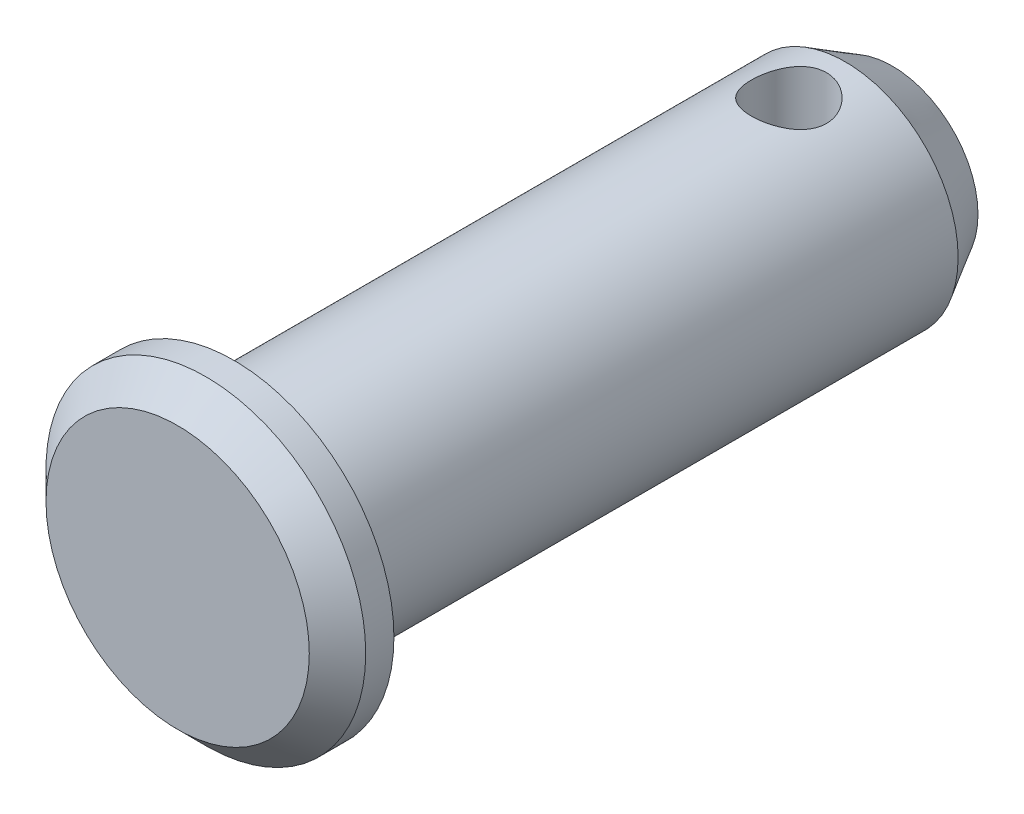
ISO-10303-21;
HEADER;
FILE_DESCRIPTION(('STEP AP214'),'2;1');
FILE_NAME('part.step','',(''),(''),'','','');
FILE_SCHEMA(('AUTOMOTIVE_DESIGN { 1 0 10303 214 1 1 1 1 }'));
ENDSEC;
DATA;
#1=APPLICATION_CONTEXT('core data for automotive mechanical design processes');
#2=APPLICATION_PROTOCOL_DEFINITION('international standard','automotive_design',2000,#1);
#3=PRODUCT_CONTEXT('',#1,'mechanical');
#4=PRODUCT('Part','Part','',(#3));
#5=PRODUCT_RELATED_PRODUCT_CATEGORY('part','',(#4));
#6=PRODUCT_DEFINITION_FORMATION('','',#4);
#7=PRODUCT_DEFINITION_CONTEXT('part definition',#1,'design');
#8=PRODUCT_DEFINITION('design','',#6,#7);
#9=PRODUCT_DEFINITION_SHAPE('','',#8);
#10=(LENGTH_UNIT() NAMED_UNIT(*) SI_UNIT(.MILLI.,.METRE.));
#11=(NAMED_UNIT(*) PLANE_ANGLE_UNIT() SI_UNIT($,.RADIAN.));
#12=(NAMED_UNIT(*) SI_UNIT($,.STERADIAN.) SOLID_ANGLE_UNIT());
#13=UNCERTAINTY_MEASURE_WITH_UNIT(LENGTH_MEASURE(1.E-05),#10,'distance_accuracy_value','');
#14=(GEOMETRIC_REPRESENTATION_CONTEXT(3) GLOBAL_UNCERTAINTY_ASSIGNED_CONTEXT((#13)) GLOBAL_UNIT_ASSIGNED_CONTEXT((#10,
#11,#12)) REPRESENTATION_CONTEXT('',''));
#15=CARTESIAN_POINT('',(0.,0.,0.));
#16=DIRECTION('',(0.,0.,1.));
#17=DIRECTION('',(1.,0.,0.));
#18=AXIS2_PLACEMENT_3D('',#15,#16,#17);
#19=CARTESIAN_POINT('',(0.,0.,19.));
#20=DIRECTION('',(0.,0.,-1.));
#21=DIRECTION('',(-1.,0.,0.));
#22=AXIS2_PLACEMENT_3D('',#19,#20,#21);
#23=PLANE('',#22);
#24=CARTESIAN_POINT('',(0.,0.,19.));
#25=DIRECTION('',(0.,0.,1.));
#26=DIRECTION('',(1.,0.,0.));
#27=AXIS2_PLACEMENT_3D('',#24,#25,#26);
#28=CIRCLE('',#27,7.);
#29=CARTESIAN_POINT('',(7.,0.,19.));
#30=VERTEX_POINT('',#29);
#31=EDGE_CURVE('E10',#30,#30,#28,.T.);
#32=ORIENTED_EDGE('',*,*,#31,.T.);
#33=EDGE_LOOP('',(#32));
#34=FACE_BOUND('',#33,.T.);
#35=ADVANCED_FACE('F33',(#34),#23,.F.);
#36=CARTESIAN_POINT('',(0.,0.,17.5));
#37=DIRECTION('',(0.,0.,-1.));
#38=DIRECTION('',(-1.,0.,0.));
#39=AXIS2_PLACEMENT_3D('',#36,#37,#38);
#40=CONICAL_SURFACE('',#39,8.5,0.785398163397445);
#41=ORIENTED_EDGE('',*,*,#31,.F.);
#42=EDGE_LOOP('',(#41));
#43=FACE_BOUND('',#42,.T.);
#44=CARTESIAN_POINT('',(0.,0.,17.5));
#45=DIRECTION('',(0.,0.,1.));
#46=DIRECTION('',(1.,0.,0.));
#47=AXIS2_PLACEMENT_3D('',#44,#45,#46);
#48=CIRCLE('',#47,8.5);
#49=CARTESIAN_POINT('',(8.5,0.,17.5));
#50=VERTEX_POINT('',#49);
#51=EDGE_CURVE('E45',#50,#50,#48,.T.);
#52=ORIENTED_EDGE('',*,*,#51,.T.);
#53=EDGE_LOOP('',(#52));
#54=FACE_BOUND('',#53,.T.);
#55=ADVANCED_FACE('F82',(#43,#54),#40,.T.);
#56=CARTESIAN_POINT('',(0.,0.,19.));
#57=DIRECTION('',(0.,0.,1.));
#58=DIRECTION('',(1.,0.,0.));
#59=AXIS2_PLACEMENT_3D('',#56,#57,#58);
#60=CYLINDRICAL_SURFACE('',#59,8.5);
#61=ORIENTED_EDGE('',*,*,#51,.F.);
#62=EDGE_LOOP('',(#61));
#63=FACE_BOUND('',#62,.T.);
#64=CARTESIAN_POINT('',(0.,0.,16.));
#65=DIRECTION('',(0.,0.,1.));
#66=DIRECTION('',(1.,0.,0.));
#67=AXIS2_PLACEMENT_3D('',#64,#65,#66);
#68=CIRCLE('',#67,8.5);
#69=CARTESIAN_POINT('',(8.5,0.,16.));
#70=VERTEX_POINT('',#69);
#71=EDGE_CURVE('E50',#70,#70,#68,.T.);
#72=ORIENTED_EDGE('',*,*,#71,.T.);
#73=EDGE_LOOP('',(#72));
#74=FACE_BOUND('',#73,.T.);
#75=ADVANCED_FACE('F86',(#63,#74),#60,.T.);
#76=CARTESIAN_POINT('',(0.,0.,16.));
#77=DIRECTION('',(0.,0.,1.));
#78=DIRECTION('',(1.,0.,0.));
#79=AXIS2_PLACEMENT_3D('',#76,#77,#78);
#80=PLANE('',#79);
#81=ORIENTED_EDGE('',*,*,#71,.F.);
#82=EDGE_LOOP('',(#81));
#83=FACE_BOUND('',#82,.T.);
#84=CARTESIAN_POINT('',(0.,0.,16.));
#85=DIRECTION('',(0.,0.,1.));
#86=DIRECTION('',(1.,0.,0.));
#87=AXIS2_PLACEMENT_3D('',#84,#85,#86);
#88=CIRCLE('',#87,6.);
#89=CARTESIAN_POINT('',(6.,0.,16.));
#90=VERTEX_POINT('',#89);
#91=EDGE_CURVE('E103',#90,#90,#88,.T.);
#92=ORIENTED_EDGE('',*,*,#91,.T.);
#93=EDGE_LOOP('',(#92));
#94=FACE_BOUND('',#93,.T.);
#95=ADVANCED_FACE('F77',(#83,#94),#80,.F.);
#96=CARTESIAN_POINT('',(0.,0.,19.));
#97=DIRECTION('',(0.,0.,1.));
#98=DIRECTION('',(1.,0.,0.));
#99=AXIS2_PLACEMENT_3D('',#96,#97,#98);
#100=CYLINDRICAL_SURFACE('',#99,6.);
#101=CARTESIAN_POINT('',(0.,-6.,-11.5));
#102=CARTESIAN_POINT('',(0.109126725773446,-6.00000030601888,-11.4999994925367));
#103=CARTESIAN_POINT('',(0.2182503890771,-5.9969953901509,-11.5089605322544));
#104=CARTESIAN_POINT('',(0.433283521745944,-5.98530420406562,-11.5444582176344));
#105=CARTESIAN_POINT('',(0.539192656237635,-5.97661734404305,-11.5709966878978));
#106=CARTESIAN_POINT('',(0.744665579003552,-5.95450615812885,-11.6406384867681));
#107=CARTESIAN_POINT('',(0.844239651772069,-5.94108975461707,-11.6837141249185));
#108=CARTESIAN_POINT('',(1.03474987361065,-5.91088891434684,-11.7850823456767));
#109=CARTESIAN_POINT('',(1.12568431391741,-5.89410381335556,-11.8433779300052));
#110=CARTESIAN_POINT('',(1.29948335004453,-5.8582818888601,-11.9756516097175));
#111=CARTESIAN_POINT('',(1.38200740059662,-5.8391911292757,-12.050062468521));
#112=CARTESIAN_POINT('',(1.53366538540417,-5.80120629566243,-12.2115343094131));
#113=CARTESIAN_POINT('',(1.60279637097892,-5.78231226581098,-12.298598069857));
#114=CARTESIAN_POINT('',(1.72764988445572,-5.74626664954548,-12.4859702303929));
#115=CARTESIAN_POINT('',(1.78292971644206,-5.72918078551376,-12.5865874794642));
#116=CARTESIAN_POINT('',(1.87563774775544,-5.69950610837202,-12.7963521889171));
#117=CARTESIAN_POINT('',(1.91307139477353,-5.68691592321491,-12.9054970343255));
#118=CARTESIAN_POINT('',(1.96774692301833,-5.66822606538755,-13.1253464429934));
#119=CARTESIAN_POINT('',(1.98562689654354,-5.66192191539223,-13.2358744169781));
#120=CARTESIAN_POINT('',(2.00268224666895,-5.65591313259015,-13.4585275083118));
#121=CARTESIAN_POINT('',(2.00186340320944,-5.6562064604546,-13.5706521214184));
#122=CARTESIAN_POINT('',(1.98203980740684,-5.6631803001636,-13.787873260888));
#123=CARTESIAN_POINT('',(1.96386782633399,-5.66956831735066,-13.893056805838));
#124=CARTESIAN_POINT('',(1.91121232569883,-5.68753315449102,-14.0987868392137));
#125=CARTESIAN_POINT('',(1.87672685318374,-5.69911059568215,-14.1993327708701));
#126=CARTESIAN_POINT('',(1.79187811612042,-5.72635822262498,-14.394825499183));
#127=CARTESIAN_POINT('',(1.74126809741453,-5.74209131586235,-14.489656050939));
#128=CARTESIAN_POINT('',(1.62577821260628,-5.77585117151453,-14.6697418165594));
#129=CARTESIAN_POINT('',(1.56089422472801,-5.79387859580927,-14.7549942538668));
#130=CARTESIAN_POINT('',(1.41469866536448,-5.83134658335482,-14.9181831963215));
#131=CARTESIAN_POINT('',(1.33270630015262,-5.85081178709686,-14.9955053890181));
#132=CARTESIAN_POINT('',(1.15667913994013,-5.88813876774073,-15.1354625333268));
#133=CARTESIAN_POINT('',(1.06264319132163,-5.90600039076135,-15.198096076329));
#134=CARTESIAN_POINT('',(0.863895226092536,-5.93834215875587,-15.3073926004701));
#135=CARTESIAN_POINT('',(0.759086552832673,-5.95278700016079,-15.3538909826815));
#136=CARTESIAN_POINT('',(0.542538166729016,-5.9764113428887,-15.4284063479114));
#137=CARTESIAN_POINT('',(0.430800876309908,-5.98559267309759,-15.4564297508469));
#138=CARTESIAN_POINT('',(0.208767659058608,-5.99735254142881,-15.4921113320447));
#139=CARTESIAN_POINT('',(0.0986191997296927,-6.00020003667456,-15.5005996183455));
#140=CARTESIAN_POINT('',(-0.121550139920475,-5.99977805389655,-15.4993346528031));
#141=CARTESIAN_POINT('',(-0.231571038639301,-5.99650960838725,-15.4895844800402));
#142=CARTESIAN_POINT('',(-0.445039732608511,-5.98440049434209,-15.4527761845281));
#143=CARTESIAN_POINT('',(-0.548585613669687,-5.97572397422385,-15.426227587901));
#144=CARTESIAN_POINT('',(-0.749711917159147,-5.9538369366014,-15.3572131110665));
#145=CARTESIAN_POINT('',(-0.847291577017213,-5.9406258409335,-15.3147452010644));
#146=CARTESIAN_POINT('',(-1.03657659278655,-5.9105786257458,-15.2138591363184));
#147=CARTESIAN_POINT('',(-1.12805991843429,-5.89365629511572,-15.1550508134337));
#148=CARTESIAN_POINT('',(-1.30012966027117,-5.85810507832525,-15.023611699973));
#149=CARTESIAN_POINT('',(-1.38071273559115,-5.83947567187655,-14.9509766879365));
#150=CARTESIAN_POINT('',(-1.5325050156126,-5.8015369596089,-14.7900424979868));
#151=CARTESIAN_POINT('',(-1.60312193849154,-5.78223522174856,-14.7011815461463));
#152=CARTESIAN_POINT('',(-1.72851504464715,-5.74599946589418,-14.5124568643782));
#153=CARTESIAN_POINT('',(-1.78329109586203,-5.72906546764005,-14.4125930427318));
#154=CARTESIAN_POINT('',(-1.87519386083272,-5.69964783582767,-14.2046539694202));
#155=CARTESIAN_POINT('',(-1.91235626433004,-5.68715521585958,-14.0965958416625));
#156=CARTESIAN_POINT('',(-1.96778933351871,-5.66821664612899,-13.8752426999117));
#157=CARTESIAN_POINT('',(-1.98606850990788,-5.66176797247279,-13.7619500691913));
#158=CARTESIAN_POINT('',(-2.00255256495468,-5.65595717748355,-13.5396058079182));
#159=CARTESIAN_POINT('',(-2.0017405146168,-5.65624800514831,-13.4306353194264));
#160=CARTESIAN_POINT('',(-1.98248458689739,-5.66302539647735,-13.2144698501559));
#161=CARTESIAN_POINT('',(-1.96404175891717,-5.66951159138724,-13.1072747640898));
#162=CARTESIAN_POINT('',(-1.91074362625869,-5.68769048609784,-12.8997286739951));
#163=CARTESIAN_POINT('',(-1.87620669203103,-5.69928196044955,-12.799286349991));
#164=CARTESIAN_POINT('',(-1.79195873151949,-5.72632797636937,-12.6055451861235));
#165=CARTESIAN_POINT('',(-1.74224433710761,-5.74178337526787,-12.512247937624));
#166=CARTESIAN_POINT('',(-1.62652138516686,-5.77565658452093,-12.3310326601542));
#167=CARTESIAN_POINT('',(-1.55989648552916,-5.79417423284274,-12.2435269962032));
#168=CARTESIAN_POINT('',(-1.4132857662713,-5.83166712566506,-12.0806203732316));
#169=CARTESIAN_POINT('',(-1.33329616890296,-5.85064249824745,-12.0052228486239));
#170=CARTESIAN_POINT('',(-1.15848311384138,-5.88780061051088,-11.8657111754216));
#171=CARTESIAN_POINT('',(-1.06320302699946,-5.90592363602514,-11.802151304498));
#172=CARTESIAN_POINT('',(-0.862714714813249,-5.93851982345224,-11.6920191422987));
#173=CARTESIAN_POINT('',(-0.757509036264697,-5.9529939181586,-11.6454425081559));
#174=CARTESIAN_POINT('',(-0.544987294401951,-5.97611030137084,-11.5725567350227));
#175=CARTESIAN_POINT('',(-0.437975515352817,-5.98498424845045,-11.5454350674732));
#176=CARTESIAN_POINT('',(-0.220640832020494,-5.99692814128444,-11.5091594386457));
#177=CARTESIAN_POINT('',(-0.110318851137493,-5.9999996906381,-11.5000005130069));
#178=CARTESIAN_POINT('',(0.,-6.,-11.5));
#179=B_SPLINE_CURVE_WITH_KNOTS('',3,(#101,#102,#103,#104,#105,#106,#107,#108,#109,#110,#111,
#112,#113,#114,#115,#116,#117,#118,#119,#120,#121,#122,#123,#124,#125,#126,#127,#128,#129,#130,
#131,#132,#133,#134,#135,#136,#137,#138,#139,#140,#141,#142,#143,#144,#145,#146,#147,#148,#149,
#150,#151,#152,#153,#154,#155,#156,#157,#158,#159,#160,#161,#162,#163,#164,#165,#166,#167,#168,
#169,#170,#171,#172,#173,#174,#175,#176,#177,#178),.UNSPECIFIED.,.T.,.F.,(4,2,2,2,2,2,2,2,2,2,2,
2,2,2,2,2,2,2,2,2,2,2,2,2,2,2,2,2,2,2,2,2,2,2,2,2,2,2,4),(0.,0.326974212052022,
0.653982370535041,0.980445345740549,1.3069727555982,1.64369368565512,1.9804886657506,
2.32696769646941,2.67334089385667,3.0080385148368,3.34263267974971,3.6619365310256,
3.98127861710964,4.30576342310261,4.63034205116414,4.97186611622734,5.31342291933237,
5.65836811300715,6.00319337754417,6.33307166350339,6.66289426328353,6.98316315956427,
7.30347290568208,7.63220799687473,7.96104361643782,8.30482045761504,8.64860016469993,
8.9916802765354,9.3346056941168,9.65991332128517,9.9852015870275,10.3043117416084,
10.6234927635196,10.9566013338361,11.2898042224756,11.635993216702,11.9820936230491,
12.3127311674763,12.6432773207628),.UNSPECIFIED.);
#180=CARTESIAN_POINT('',(0.,-6.,-11.5));
#181=VERTEX_POINT('',#180);
#182=EDGE_CURVE('E36',#181,#181,#179,.T.);
#183=ORIENTED_EDGE('',*,*,#182,.T.);
#184=EDGE_LOOP('',(#183));
#185=FACE_BOUND('',#184,.T.);
#186=CARTESIAN_POINT('',(0.,6.,-11.5));
#187=CARTESIAN_POINT('',(-0.109126725773446,6.00000030601888,-11.4999994925367));
#188=CARTESIAN_POINT('',(-0.2182503890771,5.9969953901509,-11.5089605322544));
#189=CARTESIAN_POINT('',(-0.433283521745944,5.98530420406562,-11.5444582176344));
#190=CARTESIAN_POINT('',(-0.539192656237635,5.97661734404305,-11.5709966878978));
#191=CARTESIAN_POINT('',(-0.744665579003552,5.95450615812885,-11.6406384867681));
#192=CARTESIAN_POINT('',(-0.844239651772068,5.94108975461707,-11.6837141249185));
#193=CARTESIAN_POINT('',(-1.03474987361065,5.91088891434684,-11.7850823456767));
#194=CARTESIAN_POINT('',(-1.12568431391741,5.89410381335556,-11.8433779300052));
#195=CARTESIAN_POINT('',(-1.29948335004453,5.8582818888601,-11.9756516097175));
#196=CARTESIAN_POINT('',(-1.38200740059662,5.8391911292757,-12.050062468521));
#197=CARTESIAN_POINT('',(-1.53366538540417,5.80120629566243,-12.2115343094131));
#198=CARTESIAN_POINT('',(-1.60279637097892,5.78231226581098,-12.298598069857));
#199=CARTESIAN_POINT('',(-1.72764988445572,5.74626664954548,-12.4859702303929));
#200=CARTESIAN_POINT('',(-1.78292971644206,5.72918078551377,-12.5865874794642));
#201=CARTESIAN_POINT('',(-1.87563774775544,5.69950610837203,-12.7963521889171));
#202=CARTESIAN_POINT('',(-1.91307139477353,5.68691592321492,-12.9054970343255));
#203=CARTESIAN_POINT('',(-1.96774692301833,5.66822606538755,-13.1253464429934));
#204=CARTESIAN_POINT('',(-1.98562689654354,5.66192191539223,-13.2358744169781));
#205=CARTESIAN_POINT('',(-2.00268224666895,5.65591313259015,-13.4585275083118));
#206=CARTESIAN_POINT('',(-2.00186340320944,5.6562064604546,-13.5706521214184));
#207=CARTESIAN_POINT('',(-1.98203980740684,5.66318030016361,-13.787873260888));
#208=CARTESIAN_POINT('',(-1.96386782633399,5.66956831735066,-13.893056805838));
#209=CARTESIAN_POINT('',(-1.91121232569883,5.68753315449102,-14.0987868392137));
#210=CARTESIAN_POINT('',(-1.87672685318374,5.69911059568215,-14.1993327708701));
#211=CARTESIAN_POINT('',(-1.79187811612042,5.72635822262498,-14.394825499183));
#212=CARTESIAN_POINT('',(-1.74126809741453,5.74209131586235,-14.489656050939));
#213=CARTESIAN_POINT('',(-1.62577821260628,5.77585117151453,-14.6697418165594));
#214=CARTESIAN_POINT('',(-1.56089422472801,5.79387859580927,-14.7549942538668));
#215=CARTESIAN_POINT('',(-1.41469866536448,5.83134658335482,-14.9181831963215));
#216=CARTESIAN_POINT('',(-1.33270630015262,5.85081178709686,-14.9955053890181));
#217=CARTESIAN_POINT('',(-1.15667913994013,5.88813876774074,-15.1354625333268));
#218=CARTESIAN_POINT('',(-1.06264319132163,5.90600039076135,-15.198096076329));
#219=CARTESIAN_POINT('',(-0.863895226092536,5.93834215875587,-15.3073926004701));
#220=CARTESIAN_POINT('',(-0.759086552832674,5.95278700016079,-15.3538909826815));
#221=CARTESIAN_POINT('',(-0.542538166729016,5.9764113428887,-15.4284063479114));
#222=CARTESIAN_POINT('',(-0.430800876309908,5.98559267309759,-15.4564297508469));
#223=CARTESIAN_POINT('',(-0.208767659058609,5.99735254142881,-15.4921113320447));
#224=CARTESIAN_POINT('',(-0.0986191997296927,6.00020003667456,-15.5005996183455));
#225=CARTESIAN_POINT('',(0.121550139920475,5.99977805389655,-15.4993346528031));
#226=CARTESIAN_POINT('',(0.231571038639301,5.99650960838725,-15.4895844800402));
#227=CARTESIAN_POINT('',(0.445039732608511,5.98440049434209,-15.4527761845281));
#228=CARTESIAN_POINT('',(0.548585613669686,5.97572397422385,-15.426227587901));
#229=CARTESIAN_POINT('',(0.749711917159147,5.9538369366014,-15.3572131110665));
#230=CARTESIAN_POINT('',(0.847291577017212,5.9406258409335,-15.3147452010644));
#231=CARTESIAN_POINT('',(1.03657659278655,5.9105786257458,-15.2138591363184));
#232=CARTESIAN_POINT('',(1.12805991843429,5.89365629511572,-15.1550508134337));
#233=CARTESIAN_POINT('',(1.30012966027117,5.85810507832525,-15.023611699973));
#234=CARTESIAN_POINT('',(1.38071273559115,5.83947567187655,-14.9509766879365));
#235=CARTESIAN_POINT('',(1.5325050156126,5.8015369596089,-14.7900424979868));
#236=CARTESIAN_POINT('',(1.60312193849154,5.78223522174856,-14.7011815461463));
#237=CARTESIAN_POINT('',(1.72851504464715,5.74599946589418,-14.5124568643782));
#238=CARTESIAN_POINT('',(1.78329109586203,5.72906546764005,-14.4125930427318));
#239=CARTESIAN_POINT('',(1.87519386083272,5.69964783582767,-14.2046539694202));
#240=CARTESIAN_POINT('',(1.91235626433004,5.68715521585958,-14.0965958416625));
#241=CARTESIAN_POINT('',(1.96778933351871,5.66821664612899,-13.8752426999117));
#242=CARTESIAN_POINT('',(1.98606850990788,5.66176797247279,-13.7619500691913));
#243=CARTESIAN_POINT('',(2.00255256495468,5.65595717748354,-13.5396058079182));
#244=CARTESIAN_POINT('',(2.0017405146168,5.6562480051483,-13.4306353194263));
#245=CARTESIAN_POINT('',(1.98248458689739,5.66302539647735,-13.2144698501559));
#246=CARTESIAN_POINT('',(1.96404175891717,5.66951159138723,-13.1072747640898));
#247=CARTESIAN_POINT('',(1.91074362625869,5.68769048609783,-12.8997286739951));
#248=CARTESIAN_POINT('',(1.87620669203103,5.69928196044955,-12.799286349991));
#249=CARTESIAN_POINT('',(1.79195873151949,5.72632797636937,-12.6055451861235));
#250=CARTESIAN_POINT('',(1.74224433710761,5.74178337526786,-12.512247937624));
#251=CARTESIAN_POINT('',(1.62652138516686,5.77565658452093,-12.3310326601542));
#252=CARTESIAN_POINT('',(1.55989648552916,5.79417423284274,-12.2435269962032));
#253=CARTESIAN_POINT('',(1.4132857662713,5.83166712566506,-12.0806203732316));
#254=CARTESIAN_POINT('',(1.33329616890296,5.85064249824745,-12.0052228486239));
#255=CARTESIAN_POINT('',(1.15848311384138,5.88780061051088,-11.8657111754216));
#256=CARTESIAN_POINT('',(1.06320302699946,5.90592363602513,-11.802151304498));
#257=CARTESIAN_POINT('',(0.862714714813249,5.93851982345224,-11.6920191422987));
#258=CARTESIAN_POINT('',(0.757509036264697,5.9529939181586,-11.6454425081559));
#259=CARTESIAN_POINT('',(0.544987294401952,5.97611030137084,-11.5725567350227));
#260=CARTESIAN_POINT('',(0.437975515352818,5.98498424845045,-11.5454350674732));
#261=CARTESIAN_POINT('',(0.220640832020495,5.99692814128444,-11.5091594386457));
#262=CARTESIAN_POINT('',(0.110318851137493,5.9999996906381,-11.5000005130069));
#263=CARTESIAN_POINT('',(0.,6.,-11.5));
#264=B_SPLINE_CURVE_WITH_KNOTS('',3,(#186,#187,#188,#189,#190,#191,#192,#193,#194,#195,#196,
#197,#198,#199,#200,#201,#202,#203,#204,#205,#206,#207,#208,#209,#210,#211,#212,#213,#214,#215,
#216,#217,#218,#219,#220,#221,#222,#223,#224,#225,#226,#227,#228,#229,#230,#231,#232,#233,#234,
#235,#236,#237,#238,#239,#240,#241,#242,#243,#244,#245,#246,#247,#248,#249,#250,#251,#252,#253,
#254,#255,#256,#257,#258,#259,#260,#261,#262,#263),.UNSPECIFIED.,.T.,.F.,(4,2,2,2,2,2,2,2,2,2,2,
2,2,2,2,2,2,2,2,2,2,2,2,2,2,2,2,2,2,2,2,2,2,2,2,2,2,2,4),(0.,0.326974212052022,
0.653982370535041,0.980445345740547,1.3069727555982,1.64369368565512,1.9804886657506,
2.32696769646941,2.67334089385667,3.0080385148368,3.34263267974971,3.6619365310256,
3.98127861710964,4.30576342310261,4.63034205116414,4.97186611622734,5.31342291933237,
5.65836811300715,6.00319337754416,6.33307166350339,6.66289426328353,6.98316315956427,
7.30347290568208,7.63220799687473,7.96104361643782,8.30482045761504,8.64860016469993,
8.99168027653541,9.3346056941168,9.65991332128517,9.98520158702751,10.3043117416084,
10.6234927635196,10.9566013338361,11.2898042224756,11.635993216702,11.9820936230491,
12.3127311674763,12.6432773207628),.UNSPECIFIED.);
#265=CARTESIAN_POINT('',(0.,6.,-11.5));
#266=VERTEX_POINT('',#265);
#267=EDGE_CURVE('E53',#266,#266,#264,.T.);
#268=ORIENTED_EDGE('',*,*,#267,.T.);
#269=EDGE_LOOP('',(#268));
#270=FACE_BOUND('',#269,.T.);
#271=ORIENTED_EDGE('',*,*,#91,.F.);
#272=EDGE_LOOP('',(#271));
#273=FACE_BOUND('',#272,.T.);
#274=CARTESIAN_POINT('',(0.,0.,-16.5));
#275=DIRECTION('',(0.,0.,1.));
#276=DIRECTION('',(1.,0.,0.));
#277=AXIS2_PLACEMENT_3D('',#274,#275,#276);
#278=CIRCLE('',#277,6.);
#279=CARTESIAN_POINT('',(6.,0.,-16.5));
#280=VERTEX_POINT('',#279);
#281=EDGE_CURVE('E105',#280,#280,#278,.T.);
#282=ORIENTED_EDGE('',*,*,#281,.T.);
#283=EDGE_LOOP('',(#282));
#284=FACE_BOUND('',#283,.T.);
#285=ADVANCED_FACE('F58',(#185,#270,#273,#284),#100,.T.);
#286=CARTESIAN_POINT('',(0.,0.,-19.));
#287=DIRECTION('',(0.,0.,1.));
#288=DIRECTION('',(1.,0.,0.));
#289=AXIS2_PLACEMENT_3D('',#286,#287,#288);
#290=CONICAL_SURFACE('',#289,4.55662432702594,0.523598775598298);
#291=ORIENTED_EDGE('',*,*,#281,.F.);
#292=EDGE_LOOP('',(#291));
#293=FACE_BOUND('',#292,.T.);
#294=CARTESIAN_POINT('',(0.,0.,-19.));
#295=DIRECTION('',(0.,0.,1.));
#296=DIRECTION('',(1.,0.,0.));
#297=AXIS2_PLACEMENT_3D('',#294,#295,#296);
#298=CIRCLE('',#297,4.55662432702594);
#299=CARTESIAN_POINT('',(4.55662432702594,0.,-19.));
#300=VERTEX_POINT('',#299);
#301=EDGE_CURVE('E108',#300,#300,#298,.T.);
#302=ORIENTED_EDGE('',*,*,#301,.T.);
#303=EDGE_LOOP('',(#302));
#304=FACE_BOUND('',#303,.T.);
#305=ADVANCED_FACE('F70',(#293,#304),#290,.T.);
#306=CARTESIAN_POINT('',(0.,0.,-19.));
#307=DIRECTION('',(0.,0.,1.));
#308=DIRECTION('',(1.,0.,0.));
#309=AXIS2_PLACEMENT_3D('',#306,#307,#308);
#310=PLANE('',#309);
#311=ORIENTED_EDGE('',*,*,#301,.F.);
#312=EDGE_LOOP('',(#311));
#313=FACE_BOUND('',#312,.T.);
#314=ADVANCED_FACE('F66',(#313),#310,.F.);
#315=CARTESIAN_POINT('',(0.,-8.5,-13.5));
#316=DIRECTION('',(0.,1.,0.));
#317=DIRECTION('',(0.,0.,1.));
#318=AXIS2_PLACEMENT_3D('',#315,#316,#317);
#319=CYLINDRICAL_SURFACE('',#318,2.);
#320=ORIENTED_EDGE('',*,*,#267,.F.);
#321=EDGE_LOOP('',(#320));
#322=FACE_BOUND('',#321,.T.);
#323=ORIENTED_EDGE('',*,*,#182,.F.);
#324=EDGE_LOOP('',(#323));
#325=FACE_BOUND('',#324,.T.);
#326=ADVANCED_FACE('F62',(#322,#325),#319,.F.);
#327=CLOSED_SHELL('',(#35,#55,#75,#95,#285,#305,#314,#326));
#328=MANIFOLD_SOLID_BREP('B2',#327);
#329=ADVANCED_BREP_SHAPE_REPRESENTATION('',(#18,#328),#14);
#330=SHAPE_DEFINITION_REPRESENTATION(#9,#329);
ENDSEC;
END-ISO-10303-21;
